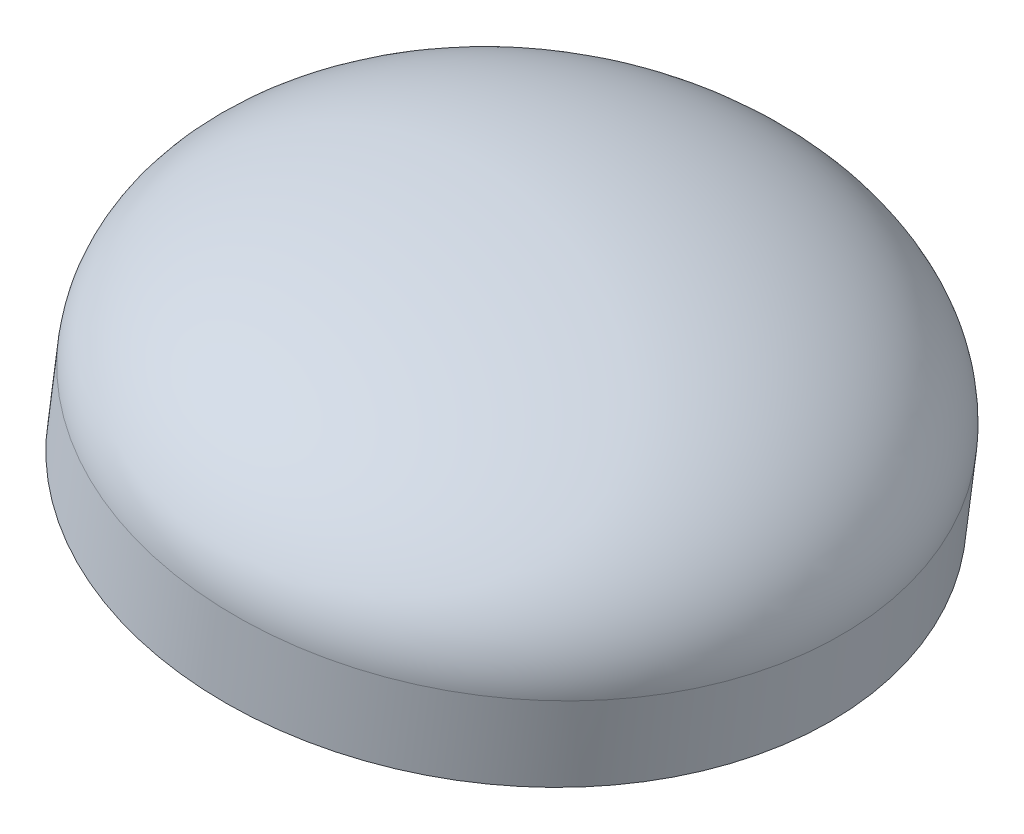
ISO-10303-21;
HEADER;
FILE_DESCRIPTION(('STEP AP214'),'2;1');
FILE_NAME('part.step','',(''),(''),'','','');
FILE_SCHEMA(('AUTOMOTIVE_DESIGN { 1 0 10303 214 1 1 1 1 }'));
ENDSEC;
DATA;
#1=APPLICATION_CONTEXT('core data for automotive mechanical design processes');
#2=APPLICATION_PROTOCOL_DEFINITION('international standard','automotive_design',2000,#1);
#3=PRODUCT_CONTEXT('',#1,'mechanical');
#4=PRODUCT('Part','Part','',(#3));
#5=PRODUCT_RELATED_PRODUCT_CATEGORY('part','',(#4));
#6=PRODUCT_DEFINITION_FORMATION('','',#4);
#7=PRODUCT_DEFINITION_CONTEXT('part definition',#1,'design');
#8=PRODUCT_DEFINITION('design','',#6,#7);
#9=PRODUCT_DEFINITION_SHAPE('','',#8);
#10=(LENGTH_UNIT() NAMED_UNIT(*) SI_UNIT(.MILLI.,.METRE.));
#11=(NAMED_UNIT(*) PLANE_ANGLE_UNIT() SI_UNIT($,.RADIAN.));
#12=(NAMED_UNIT(*) SI_UNIT($,.STERADIAN.) SOLID_ANGLE_UNIT());
#13=UNCERTAINTY_MEASURE_WITH_UNIT(LENGTH_MEASURE(1.E-05),#10,'distance_accuracy_value','');
#14=(GEOMETRIC_REPRESENTATION_CONTEXT(3) GLOBAL_UNCERTAINTY_ASSIGNED_CONTEXT((#13)) GLOBAL_UNIT_ASSIGNED_CONTEXT((#10,
#11,#12)) REPRESENTATION_CONTEXT('',''));
#15=CARTESIAN_POINT('',(0.,0.,0.));
#16=DIRECTION('',(0.,0.,1.));
#17=DIRECTION('',(1.,0.,0.));
#18=AXIS2_PLACEMENT_3D('',#15,#16,#17);
#19=CARTESIAN_POINT('',(-227.930521212245,-25.4571821872427,0.));
#20=DIRECTION('',(-0.133352853893746,-0.991068623435528,0.));
#21=DIRECTION('',(0.991068623435528,-0.133352853893746,0.));
#22=AXIS2_PLACEMENT_3D('',#19,#20,#21);
#23=PLANE('',#22);
#24=CARTESIAN_POINT('',(-7.41775249783962,-55.1281921786013,0.));
#25=DIRECTION('',(0.133352853893746,0.991068623435528,0.));
#26=DIRECTION('',(-0.991068623435528,0.133352853893746,0.));
#27=AXIS2_PLACEMENT_3D('',#24,#25,#26);
#28=CIRCLE('',#27,222.5);
#29=CARTESIAN_POINT('',(-227.930521212245,-25.4571821872428,0.));
#30=VERTEX_POINT('',#29);
#31=EDGE_CURVE('E77',#30,#30,#28,.T.);
#32=ORIENTED_EDGE('',*,*,#31,.T.);
#33=EDGE_LOOP('',(#32));
#34=FACE_BOUND('',#33,.T.);
#35=CARTESIAN_POINT('',(-7.41775249783962,-55.1281921786012,0.));
#36=DIRECTION('',(-0.133352853893746,-0.991068623435528,0.));
#37=DIRECTION('',(0.991068623435528,-0.133352853893746,0.));
#38=AXIS2_PLACEMENT_3D('',#35,#36,#37);
#39=CIRCLE('',#38,224.5);
#40=CARTESIAN_POINT('',(215.077153463437,-85.0659078777472,0.));
#41=VERTEX_POINT('',#40);
#42=EDGE_CURVE('E43',#41,#41,#39,.F.);
#43=ORIENTED_EDGE('',*,*,#42,.F.);
#44=EDGE_LOOP('',(#43));
#45=FACE_BOUND('',#44,.T.);
#46=ADVANCED_FACE('F34',(#34,#45),#23,.T.);
#47=CARTESIAN_POINT('',(0.,0.,0.));
#48=DIRECTION('',(0.,0.,1.));
#49=DIRECTION('',(-0.991068623435528,0.133352853893746,0.));
#50=AXIS2_PLACEMENT_3D('',#47,#48,#49);
#51=ELLIPSE('',#50,222.5,111.25);
#52=TRIMMED_CURVE('',#51,(PARAMETER_VALUE(4.71238898038469)),
(PARAMETER_VALUE(7.85398163397448)),.T.,.PARAMETER.);
#53=CARTESIAN_POINT('',(14.8355049956792,110.256384357203,0.));
#54=DIRECTION('',(0.133352853893746,0.991068623435528,0.));
#55=AXIS1_PLACEMENT('',#53,#54);
#56=SURFACE_OF_REVOLUTION('',#52,#55);
#57=OFFSET_SURFACE('',#56,-2.,.F.);
#58=CARTESIAN_POINT('',(0.,0.,0.));
#59=DIRECTION('',(0.133352853893746,0.991068623435528,0.));
#60=DIRECTION('',(-0.991068623435528,0.133352853893746,0.));
#61=AXIS2_PLACEMENT_3D('',#58,#59,#60);
#62=CIRCLE('',#61,224.5);
#63=CARTESIAN_POINT('',(-222.494905961276,29.937715699146,0.));
#64=VERTEX_POINT('',#63);
#65=EDGE_CURVE('E11',#64,#64,#62,.T.);
#66=ORIENTED_EDGE('',*,*,#65,.T.);
#67=EDGE_LOOP('',(#66));
#68=FACE_BOUND('',#67,.T.);
#69=CARTESIAN_POINT('',(15.1022107034668,112.238521604074,0.));
#70=VERTEX_POINT('',#69);
#71=VERTEX_LOOP('',#70);
#72=FACE_BOUND('',#71,.T.);
#73=ADVANCED_FACE('F61',(#68,#72),#57,.F.);
#74=CARTESIAN_POINT('',(14.8355049956792,110.256384357203,0.));
#75=DIRECTION('',(0.133352853893746,0.991068623435528,0.));
#76=DIRECTION('',(-0.991068623435528,0.133352853893746,0.));
#77=AXIS2_PLACEMENT_3D('',#74,#75,#76);
#78=CYLINDRICAL_SURFACE('',#77,224.5);
#79=ORIENTED_EDGE('',*,*,#42,.T.);
#80=EDGE_LOOP('',(#79));
#81=FACE_BOUND('',#80,.T.);
#82=ORIENTED_EDGE('',*,*,#65,.F.);
#83=EDGE_LOOP('',(#82));
#84=FACE_BOUND('',#83,.T.);
#85=ADVANCED_FACE('F36',(#81,#84),#78,.T.);
#86=CARTESIAN_POINT('',(0.,0.,0.));
#87=DIRECTION('',(0.,0.,1.));
#88=DIRECTION('',(-0.991068623435528,0.133352853893746,0.));
#89=AXIS2_PLACEMENT_3D('',#86,#87,#88);
#90=ELLIPSE('',#89,222.5,111.25);
#91=TRIMMED_CURVE('',#90,(PARAMETER_VALUE(4.71238898038469)),
(PARAMETER_VALUE(7.85398163397448)),.T.,.PARAMETER.);
#92=CARTESIAN_POINT('',(14.8355049956792,110.256384357203,0.));
#93=DIRECTION('',(0.133352853893746,0.991068623435528,0.));
#94=AXIS1_PLACEMENT('',#92,#93);
#95=SURFACE_OF_REVOLUTION('',#91,#94);
#96=CARTESIAN_POINT('',(0.,0.,0.));
#97=DIRECTION('',(0.133352853893746,0.991068623435528,0.));
#98=DIRECTION('',(-0.991068623435528,0.133352853893746,0.));
#99=AXIS2_PLACEMENT_3D('',#96,#97,#98);
#100=CIRCLE('',#99,222.5);
#101=CARTESIAN_POINT('',(-220.512768714405,29.6710099913585,0.));
#102=VERTEX_POINT('',#101);
#103=EDGE_CURVE('E80',#102,#102,#100,.T.);
#104=ORIENTED_EDGE('',*,*,#103,.F.);
#105=EDGE_LOOP('',(#104));
#106=FACE_BOUND('',#105,.T.);
#107=CARTESIAN_POINT('',(14.8355049956792,110.256384357203,0.));
#108=VERTEX_POINT('',#107);
#109=VERTEX_LOOP('',#108);
#110=FACE_BOUND('',#109,.T.);
#111=ADVANCED_FACE('F50',(#106,#110),#95,.T.);
#112=CARTESIAN_POINT('',(14.8355049956792,110.256384357203,0.));
#113=DIRECTION('',(0.133352853893746,0.991068623435528,0.));
#114=DIRECTION('',(-0.991068623435528,0.133352853893746,0.));
#115=AXIS2_PLACEMENT_3D('',#112,#113,#114);
#116=CYLINDRICAL_SURFACE('',#115,222.5);
#117=ORIENTED_EDGE('',*,*,#31,.F.);
#118=EDGE_LOOP('',(#117));
#119=FACE_BOUND('',#118,.T.);
#120=ORIENTED_EDGE('',*,*,#103,.T.);
#121=EDGE_LOOP('',(#120));
#122=FACE_BOUND('',#121,.T.);
#123=ADVANCED_FACE('F52',(#119,#122),#116,.F.);
#124=CLOSED_SHELL('',(#46,#73,#85,#111,#123));
#125=MANIFOLD_SOLID_BREP('B2',#124);
#126=ADVANCED_BREP_SHAPE_REPRESENTATION('',(#18,#125),#14);
#127=SHAPE_DEFINITION_REPRESENTATION(#9,#126);
ENDSEC;
END-ISO-10303-21;
